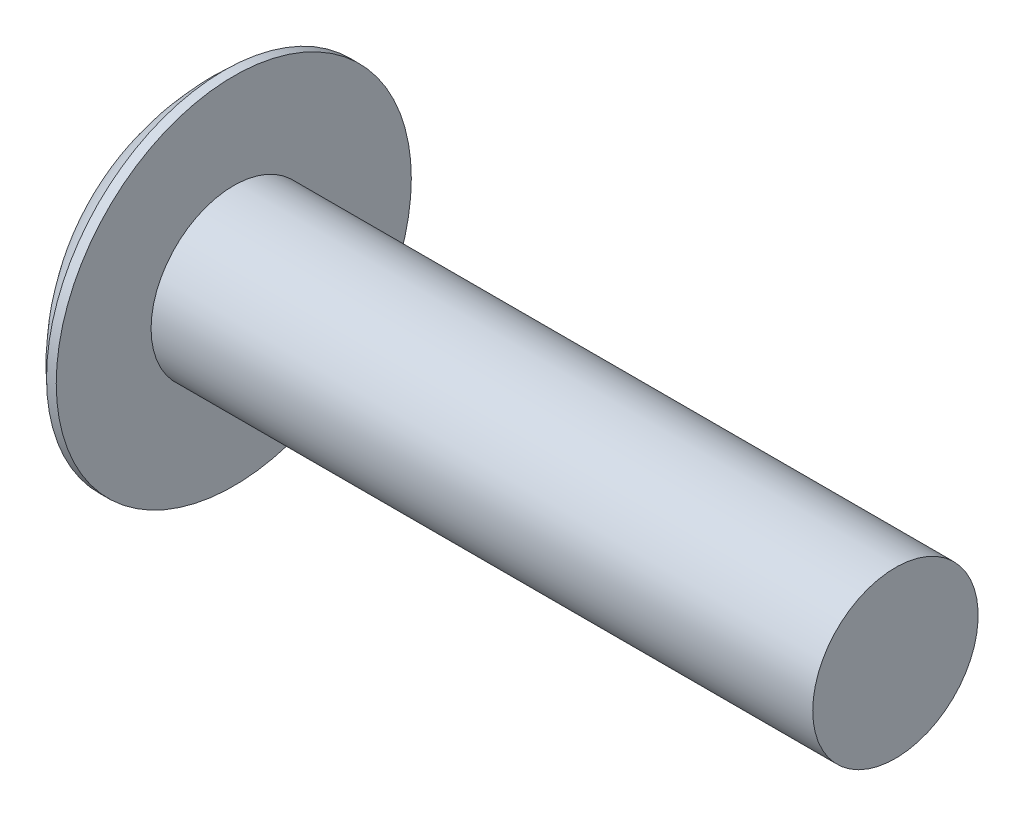
ISO-10303-21;
HEADER;
FILE_DESCRIPTION(('STEP AP214'),'2;1');
FILE_NAME('part.step','',(''),(''),'','','');
FILE_SCHEMA(('AUTOMOTIVE_DESIGN { 1 0 10303 214 1 1 1 1 }'));
ENDSEC;
DATA;
#1=APPLICATION_CONTEXT('core data for automotive mechanical design processes');
#2=APPLICATION_PROTOCOL_DEFINITION('international standard','automotive_design',2000,#1);
#3=PRODUCT_CONTEXT('',#1,'mechanical');
#4=PRODUCT('Part','Part','',(#3));
#5=PRODUCT_RELATED_PRODUCT_CATEGORY('part','',(#4));
#6=PRODUCT_DEFINITION_FORMATION('','',#4);
#7=PRODUCT_DEFINITION_CONTEXT('part definition',#1,'design');
#8=PRODUCT_DEFINITION('design','',#6,#7);
#9=PRODUCT_DEFINITION_SHAPE('','',#8);
#10=(LENGTH_UNIT() NAMED_UNIT(*) SI_UNIT(.MILLI.,.METRE.));
#11=(NAMED_UNIT(*) PLANE_ANGLE_UNIT() SI_UNIT($,.RADIAN.));
#12=(NAMED_UNIT(*) SI_UNIT($,.STERADIAN.) SOLID_ANGLE_UNIT());
#13=UNCERTAINTY_MEASURE_WITH_UNIT(LENGTH_MEASURE(1.E-05),#10,'distance_accuracy_value','');
#14=(GEOMETRIC_REPRESENTATION_CONTEXT(3) GLOBAL_UNCERTAINTY_ASSIGNED_CONTEXT((#13)) GLOBAL_UNIT_ASSIGNED_CONTEXT((#10,
#11,#12)) REPRESENTATION_CONTEXT('',''));
#15=CARTESIAN_POINT('',(0.,0.,0.));
#16=DIRECTION('',(0.,0.,1.));
#17=DIRECTION('',(1.,0.,0.));
#18=AXIS2_PLACEMENT_3D('',#15,#16,#17);
#19=CARTESIAN_POINT('',(13.6652,0.,0.));
#20=DIRECTION('',(-1.,0.,0.));
#21=DIRECTION('',(0.,1.,0.));
#22=AXIS2_PLACEMENT_3D('',#19,#20,#21);
#23=SPHERICAL_SURFACE('',#22,13.6652);
#24=CARTESIAN_POINT('',(4.59780021891611,0.,0.));
#25=DIRECTION('',(-1.,0.,0.));
#26=DIRECTION('',(0.,0.,1.));
#27=AXIS2_PLACEMENT_3D('',#24,#25,#26);
#28=CIRCLE('',#27,10.2235);
#29=CARTESIAN_POINT('',(4.59780021891611,0.,10.2235));
#30=VERTEX_POINT('',#29);
#31=EDGE_CURVE('E266',#30,#30,#28,.T.);
#32=ORIENTED_EDGE('',*,*,#31,.T.);
#33=EDGE_LOOP('',(#32));
#34=FACE_BOUND('',#33,.T.);
#35=CARTESIAN_POINT('',(13.6853681647485,0.294413621482627,0.));
#36=DIRECTION('',(-0.0683426588936529,-0.997661907148582,0.));
#37=DIRECTION('',(0.997661907148582,-0.0683426588936529,0.));
#38=AXIS2_PLACEMENT_3D('',#35,#36,#37);
#39=CIRCLE('',#38,13.6620132083312);
#40=CARTESIAN_POINT('',(1.5743937812783,1.12404957854235,6.26790304378582));
#41=VERTEX_POINT('',#40);
#42=CARTESIAN_POINT('',(0.110141872061403,1.22435497062856,1.22435497062856));
#43=VERTEX_POINT('',#42);
#44=EDGE_CURVE('E351',#41,#43,#39,.T.);
#45=ORIENTED_EDGE('',*,*,#44,.F.);
#46=CARTESIAN_POINT('',(12.2452923968943,0.,-1.8633819888764));
#47=DIRECTION('',(0.606093986265618,0.,0.795393034802702));
#48=DIRECTION('',(0.795393034802702,0.,-0.606093986265618));
#49=AXIS2_PLACEMENT_3D('',#46,#47,#48);
#50=CIRCLE('',#49,13.4628882860319);
#51=CARTESIAN_POINT('',(1.57312856055564,1.1049,6.26886714912462));
#52=VERTEX_POINT('',#51);
#53=EDGE_CURVE('E236',#41,#52,#50,.T.);
#54=ORIENTED_EDGE('',*,*,#53,.T.);
#55=CARTESIAN_POINT('',(13.6652,1.1049,0.));
#56=DIRECTION('',(0.,1.,0.));
#57=DIRECTION('',(0.,0.,1.));
#58=AXIS2_PLACEMENT_3D('',#55,#56,#57);
#59=CIRCLE('',#58,13.620458400142);
#60=CARTESIAN_POINT('',(2.8448,1.1049,8.27259517140782));
#61=VERTEX_POINT('',#60);
#62=EDGE_CURVE('E283',#52,#61,#59,.T.);
#63=ORIENTED_EDGE('',*,*,#62,.T.);
#64=CARTESIAN_POINT('',(2.8448,0.,0.));
#65=DIRECTION('',(-1.,0.,0.));
#66=DIRECTION('',(0.,0.,1.));
#67=AXIS2_PLACEMENT_3D('',#64,#65,#66);
#68=CIRCLE('',#67,8.34605504894378);
#69=CARTESIAN_POINT('',(2.8448,-1.1049,8.27259517140782));
#70=VERTEX_POINT('',#69);
#71=EDGE_CURVE('E275',#70,#61,#68,.T.);
#72=ORIENTED_EDGE('',*,*,#71,.F.);
#73=CARTESIAN_POINT('',(13.6652,-1.1049,0.));
#74=DIRECTION('',(0.,-1.,0.));
#75=DIRECTION('',(0.,0.,-1.));
#76=AXIS2_PLACEMENT_3D('',#73,#74,#75);
#77=CIRCLE('',#76,13.620458400142);
#78=CARTESIAN_POINT('',(1.57312856055563,-1.1049,6.26886714912462));
#79=VERTEX_POINT('',#78);
#80=EDGE_CURVE('E280',#70,#79,#77,.T.);
#81=ORIENTED_EDGE('',*,*,#80,.T.);
#82=CARTESIAN_POINT('',(1.5743937812783,-1.1240495785424,6.26790304378581));
#83=VERTEX_POINT('',#82);
#84=EDGE_CURVE('E368',#79,#83,#50,.T.);
#85=ORIENTED_EDGE('',*,*,#84,.T.);
#86=CARTESIAN_POINT('',(13.6853681647485,-0.294413621482627,0.));
#87=DIRECTION('',(-0.068342658893653,0.997661907148582,0.));
#88=DIRECTION('',(-0.997661907148582,-0.068342658893653,0.));
#89=AXIS2_PLACEMENT_3D('',#86,#87,#88);
#90=CIRCLE('',#89,13.6620132083312);
#91=CARTESIAN_POINT('',(0.110141872061405,-1.22435497062857,1.22435497062856));
#92=VERTEX_POINT('',#91);
#93=EDGE_CURVE('E298',#92,#83,#90,.T.);
#94=ORIENTED_EDGE('',*,*,#93,.F.);
#95=CARTESIAN_POINT('',(13.6853681647485,0.,0.294413621482627));
#96=DIRECTION('',(-0.068342658893653,0.,-0.997661907148582));
#97=DIRECTION('',(-0.997661907148582,0.,0.068342658893653));
#98=AXIS2_PLACEMENT_3D('',#95,#96,#97);
#99=CIRCLE('',#98,13.6620132083312);
#100=CARTESIAN_POINT('',(1.57439378127831,-6.26790304378581,1.12404957854238));
#101=VERTEX_POINT('',#100);
#102=EDGE_CURVE('E243',#101,#92,#99,.T.);
#103=ORIENTED_EDGE('',*,*,#102,.F.);
#104=CARTESIAN_POINT('',(12.2452923968943,1.8633819888764,0.));
#105=DIRECTION('',(0.606093986265618,-0.795393034802702,0.));
#106=DIRECTION('',(0.795393034802702,0.606093986265618,0.));
#107=AXIS2_PLACEMENT_3D('',#104,#105,#106);
#108=CIRCLE('',#107,13.4628882860319);
#109=CARTESIAN_POINT('',(1.57439378127831,-6.26790304378581,-1.12404957854238));
#110=VERTEX_POINT('',#109);
#111=EDGE_CURVE('E40',#101,#110,#108,.T.);
#112=ORIENTED_EDGE('',*,*,#111,.T.);
#113=CARTESIAN_POINT('',(13.6853681647485,0.,-0.294413621482627));
#114=DIRECTION('',(-0.0683426588936529,0.,0.997661907148582));
#115=DIRECTION('',(0.997661907148582,0.,0.0683426588936529));
#116=AXIS2_PLACEMENT_3D('',#113,#114,#115);
#117=CIRCLE('',#116,13.6620132083312);
#118=CARTESIAN_POINT('',(0.110141872061405,-1.22435497062856,-1.22435497062856));
#119=VERTEX_POINT('',#118);
#120=EDGE_CURVE('E252',#119,#110,#117,.T.);
#121=ORIENTED_EDGE('',*,*,#120,.F.);
#122=CARTESIAN_POINT('',(1.5743937812783,-1.12404957854236,-6.26790304378582));
#123=VERTEX_POINT('',#122);
#124=EDGE_CURVE('E47',#123,#119,#90,.T.);
#125=ORIENTED_EDGE('',*,*,#124,.F.);
#126=CARTESIAN_POINT('',(12.2452923968943,0.,1.8633819888764));
#127=DIRECTION('',(0.606093986265618,0.,-0.795393034802702));
#128=DIRECTION('',(-0.795393034802702,0.,-0.606093986265618));
#129=AXIS2_PLACEMENT_3D('',#126,#127,#128);
#130=CIRCLE('',#129,13.4628882860319);
#131=CARTESIAN_POINT('',(1.57312856055564,-1.1049,-6.26886714912463));
#132=VERTEX_POINT('',#131);
#133=EDGE_CURVE('E404',#123,#132,#130,.T.);
#134=ORIENTED_EDGE('',*,*,#133,.T.);
#135=CARTESIAN_POINT('',(2.8448,-1.1049,-8.27259517140782));
#136=VERTEX_POINT('',#135);
#137=EDGE_CURVE('E278',#132,#136,#77,.T.);
#138=ORIENTED_EDGE('',*,*,#137,.T.);
#139=CARTESIAN_POINT('',(2.8448,1.1049,-8.27259517140782));
#140=VERTEX_POINT('',#139);
#141=EDGE_CURVE('E279',#140,#136,#68,.T.);
#142=ORIENTED_EDGE('',*,*,#141,.F.);
#143=CARTESIAN_POINT('',(1.57312856055563,1.1049,-6.26886714912462));
#144=VERTEX_POINT('',#143);
#145=EDGE_CURVE('E284',#140,#144,#59,.T.);
#146=ORIENTED_EDGE('',*,*,#145,.T.);
#147=CARTESIAN_POINT('',(1.5743937812783,1.1240495785424,-6.26790304378581));
#148=VERTEX_POINT('',#147);
#149=EDGE_CURVE('E217',#144,#148,#130,.T.);
#150=ORIENTED_EDGE('',*,*,#149,.T.);
#151=CARTESIAN_POINT('',(0.110141872061403,1.22435497062857,-1.22435497062856));
#152=VERTEX_POINT('',#151);
#153=EDGE_CURVE('E353',#152,#148,#39,.T.);
#154=ORIENTED_EDGE('',*,*,#153,.F.);
#155=CARTESIAN_POINT('',(1.5743937812783,6.26790304378581,-1.12404957854238));
#156=VERTEX_POINT('',#155);
#157=EDGE_CURVE('E254',#156,#152,#117,.T.);
#158=ORIENTED_EDGE('',*,*,#157,.F.);
#159=CARTESIAN_POINT('',(12.2452923968943,-1.86338198887639,0.));
#160=DIRECTION('',(0.606093986265618,0.795393034802702,0.));
#161=DIRECTION('',(-0.795393034802702,0.606093986265618,0.));
#162=AXIS2_PLACEMENT_3D('',#159,#160,#161);
#163=CIRCLE('',#162,13.4628882860319);
#164=CARTESIAN_POINT('',(1.5743937812783,6.26790304378581,1.12404957854238));
#165=VERTEX_POINT('',#164);
#166=EDGE_CURVE('E11',#156,#165,#163,.T.);
#167=ORIENTED_EDGE('',*,*,#166,.T.);
#168=EDGE_CURVE('E245',#43,#165,#99,.T.);
#169=ORIENTED_EDGE('',*,*,#168,.F.);
#170=EDGE_LOOP('',(#45,#54,#63,#72,#81,#85,#94,#103,#112,#121,#125,#134,#138,#142,#146,#150,
#154,#158,#167,#169));
#171=FACE_BOUND('',#170,.T.);
#172=ADVANCED_FACE('F32',(#34,#171),#23,.T.);
#173=CARTESIAN_POINT('',(2.8448,1.1049,10.2235));
#174=DIRECTION('',(0.,1.,0.));
#175=DIRECTION('',(0.,0.,1.));
#176=AXIS2_PLACEMENT_3D('',#173,#174,#175);
#177=PLANE('',#176);
#178=DIRECTION('',(0.,0.,1.));
#179=VECTOR('',#178,1.);
#180=CARTESIAN_POINT('',(1.85393814432936,1.1049,10.2234999999999));
#181=LINE('',#180,#179);
#182=CARTESIAN_POINT('',(1.85393814432911,1.10490000000004,-6.0548886597944));
#183=VERTEX_POINT('',#182);
#184=CARTESIAN_POINT('',(1.85393814433002,1.1049,-1.10489999999999));
#185=VERTEX_POINT('',#184);
#186=EDGE_CURVE('E55',#183,#185,#181,.T.);
#187=ORIENTED_EDGE('',*,*,#186,.F.);
#188=DIRECTION('',(-0.795393034802702,0.,-0.606093986265618));
#189=VECTOR('',#188,1.);
#190=CARTESIAN_POINT('',(10.3283403604017,1.1049,0.40265370683152));
#191=LINE('',#190,#189);
#192=EDGE_CURVE('E400',#183,#144,#191,.T.);
#193=ORIENTED_EDGE('',*,*,#192,.T.);
#194=ORIENTED_EDGE('',*,*,#145,.F.);
#195=DIRECTION('',(0.,0.,-1.));
#196=VECTOR('',#195,1.);
#197=CARTESIAN_POINT('',(2.8448,1.1049,10.2235));
#198=LINE('',#197,#196);
#199=CARTESIAN_POINT('',(2.8448,1.1049,-1.03702316384181));
#200=VERTEX_POINT('',#199);
#201=EDGE_CURVE('E259',#200,#140,#198,.T.);
#202=ORIENTED_EDGE('',*,*,#201,.F.);
#203=DIRECTION('',(0.997661907148582,0.,0.0683426588936529));
#204=VECTOR('',#203,1.);
#205=CARTESIAN_POINT('',(3.61257475786375,1.1049,-0.984428424072896));
#206=LINE('',#205,#204);
#207=EDGE_CURVE('E249',#185,#200,#206,.T.);
#208=ORIENTED_EDGE('',*,*,#207,.F.);
#209=EDGE_LOOP('',(#187,#193,#194,#202,#208));
#210=FACE_BOUND('',#209,.T.);
#211=ADVANCED_FACE('F398',(#210),#177,.F.);
#212=CARTESIAN_POINT('',(2.8448,-1.1049,-10.2235));
#213=DIRECTION('',(0.,-1.,0.));
#214=DIRECTION('',(0.,0.,-1.));
#215=AXIS2_PLACEMENT_3D('',#212,#213,#214);
#216=PLANE('',#215);
#217=DIRECTION('',(0.,0.,-1.));
#218=VECTOR('',#217,1.);
#219=CARTESIAN_POINT('',(1.85393814432939,-1.1049,-10.2234999999999));
#220=LINE('',#219,#218);
#221=CARTESIAN_POINT('',(1.85393814433002,-1.10489999999999,-1.10489999999999));
#222=VERTEX_POINT('',#221);
#223=CARTESIAN_POINT('',(1.85393814432957,-1.1049,-6.05488865979406));
#224=VERTEX_POINT('',#223);
#225=EDGE_CURVE('E327',#222,#224,#220,.T.);
#226=ORIENTED_EDGE('',*,*,#225,.F.);
#227=DIRECTION('',(-0.997661907148582,0.,-0.0683426588936529));
#228=VECTOR('',#227,1.);
#229=CARTESIAN_POINT('',(2.2184396679019,-1.1049,-1.07993061597));
#230=LINE('',#229,#228);
#231=CARTESIAN_POINT('',(2.8448,-1.1049,-1.03702316384181));
#232=VERTEX_POINT('',#231);
#233=EDGE_CURVE('E246',#232,#222,#230,.T.);
#234=ORIENTED_EDGE('',*,*,#233,.F.);
#235=DIRECTION('',(0.,0.,1.));
#236=VECTOR('',#235,1.);
#237=CARTESIAN_POINT('',(2.8448,-1.1049,-10.2235));
#238=LINE('',#237,#236);
#239=EDGE_CURVE('E260',#136,#232,#238,.T.);
#240=ORIENTED_EDGE('',*,*,#239,.F.);
#241=ORIENTED_EDGE('',*,*,#137,.F.);
#242=DIRECTION('',(0.795393034802702,0.,0.606093986265618));
#243=VECTOR('',#242,1.);
#244=CARTESIAN_POINT('',(0.471190586177314,-1.1049,-7.10855011123918));
#245=LINE('',#244,#243);
#246=EDGE_CURVE('E408',#132,#224,#245,.T.);
#247=ORIENTED_EDGE('',*,*,#246,.T.);
#248=EDGE_LOOP('',(#226,#234,#240,#241,#247));
#249=FACE_BOUND('',#248,.T.);
#250=ADVANCED_FACE('F325',(#249),#216,.F.);
#251=CARTESIAN_POINT('',(2.8448,1.1049,-10.2235));
#252=DIRECTION('',(-1.,0.,0.));
#253=DIRECTION('',(0.,0.,1.));
#254=AXIS2_PLACEMENT_3D('',#251,#252,#253);
#255=PLANE('',#254);
#256=DIRECTION('',(0.,-1.,0.));
#257=VECTOR('',#256,1.);
#258=CARTESIAN_POINT('',(2.8448,1.10489999999999,-5.29984632768361));
#259=LINE('',#258,#257);
#260=CARTESIAN_POINT('',(2.8448,1.03702316384183,-5.29984632768361));
#261=VERTEX_POINT('',#260);
#262=CARTESIAN_POINT('',(2.8448,-1.03702316384179,-5.29984632768362));
#263=VERTEX_POINT('',#262);
#264=EDGE_CURVE('E338',#261,#263,#259,.T.);
#265=ORIENTED_EDGE('',*,*,#264,.F.);
#266=DIRECTION('',(0.,0.,1.));
#267=VECTOR('',#266,1.);
#268=CARTESIAN_POINT('',(2.8448,1.03702316384184,-10.2235));
#269=LINE('',#268,#267);
#270=CARTESIAN_POINT('',(2.8448,1.03702316384181,-1.03702316384181));
#271=VERTEX_POINT('',#270);
#272=EDGE_CURVE('E360',#261,#271,#269,.T.);
#273=ORIENTED_EDGE('',*,*,#272,.T.);
#274=DIRECTION('',(0.,1.,0.));
#275=VECTOR('',#274,1.);
#276=CARTESIAN_POINT('',(2.8448,1.1049,-1.03702316384181));
#277=LINE('',#276,#275);
#278=EDGE_CURVE('E290',#271,#200,#277,.T.);
#279=ORIENTED_EDGE('',*,*,#278,.T.);
#280=ORIENTED_EDGE('',*,*,#201,.T.);
#281=ORIENTED_EDGE('',*,*,#141,.T.);
#282=ORIENTED_EDGE('',*,*,#239,.T.);
#283=CARTESIAN_POINT('',(2.8448,-1.03702316384181,-1.03702316384181));
#284=VERTEX_POINT('',#283);
#285=EDGE_CURVE('E291',#232,#284,#277,.T.);
#286=ORIENTED_EDGE('',*,*,#285,.T.);
#287=DIRECTION('',(0.,0.,-1.));
#288=VECTOR('',#287,1.);
#289=CARTESIAN_POINT('',(2.8448,-1.03702316384177,-10.2235));
#290=LINE('',#289,#288);
#291=EDGE_CURVE('E336',#284,#263,#290,.T.);
#292=ORIENTED_EDGE('',*,*,#291,.T.);
#293=EDGE_LOOP('',(#265,#273,#279,#280,#281,#282,#286,#292));
#294=FACE_BOUND('',#293,.T.);
#295=ADVANCED_FACE('F318',(#294),#255,.T.);
#296=DIRECTION('',(0.,-1.,0.));
#297=VECTOR('',#296,1.);
#298=CARTESIAN_POINT('',(2.8448,1.1049,1.03702316384181));
#299=LINE('',#298,#297);
#300=CARTESIAN_POINT('',(2.8448,1.1049,1.03702316384181));
#301=VERTEX_POINT('',#300);
#302=CARTESIAN_POINT('',(2.8448,1.0370231638418,1.03702316384181));
#303=VERTEX_POINT('',#302);
#304=EDGE_CURVE('E287',#301,#303,#299,.T.);
#305=ORIENTED_EDGE('',*,*,#304,.T.);
#306=DIRECTION('',(0.,0.,1.));
#307=VECTOR('',#306,1.);
#308=CARTESIAN_POINT('',(2.8448,1.03702316384184,-10.2235));
#309=LINE('',#308,#307);
#310=CARTESIAN_POINT('',(2.8448,1.03702316384179,5.29984632768362));
#311=VERTEX_POINT('',#310);
#312=EDGE_CURVE('E354',#303,#311,#309,.T.);
#313=ORIENTED_EDGE('',*,*,#312,.T.);
#314=DIRECTION('',(0.,1.,0.));
#315=VECTOR('',#314,1.);
#316=CARTESIAN_POINT('',(2.8448,1.10489999999995,5.29984632768362));
#317=LINE('',#316,#315);
#318=CARTESIAN_POINT('',(2.8448,-1.03702316384183,5.29984632768361));
#319=VERTEX_POINT('',#318);
#320=EDGE_CURVE('E364',#319,#311,#317,.T.);
#321=ORIENTED_EDGE('',*,*,#320,.F.);
#322=DIRECTION('',(0.,0.,-1.));
#323=VECTOR('',#322,1.);
#324=CARTESIAN_POINT('',(2.8448,-1.03702316384177,-10.2235));
#325=LINE('',#324,#323);
#326=CARTESIAN_POINT('',(2.8448,-1.03702316384181,1.03702316384181));
#327=VERTEX_POINT('',#326);
#328=EDGE_CURVE('E188',#319,#327,#325,.T.);
#329=ORIENTED_EDGE('',*,*,#328,.T.);
#330=CARTESIAN_POINT('',(2.8448,-1.1049,1.03702316384181));
#331=VERTEX_POINT('',#330);
#332=EDGE_CURVE('E216',#327,#331,#299,.T.);
#333=ORIENTED_EDGE('',*,*,#332,.T.);
#334=EDGE_CURVE('E258',#331,#70,#238,.T.);
#335=ORIENTED_EDGE('',*,*,#334,.T.);
#336=ORIENTED_EDGE('',*,*,#71,.T.);
#337=EDGE_CURVE('E255',#61,#301,#198,.T.);
#338=ORIENTED_EDGE('',*,*,#337,.T.);
#339=EDGE_LOOP('',(#305,#313,#321,#329,#333,#335,#336,#338));
#340=FACE_BOUND('',#339,.T.);
#341=ADVANCED_FACE('F311',(#340),#255,.T.);
#342=CARTESIAN_POINT('',(9.79992734012975,0.,-0.560577293790547));
#343=DIRECTION('',(-0.0683426588936529,0.,0.997661907148582));
#344=DIRECTION('',(0.997661907148582,0.,0.0683426588936529));
#345=AXIS2_PLACEMENT_3D('',#342,#343,#344);
#346=PLANE('',#345);
#347=ORIENTED_EDGE('',*,*,#157,.T.);
#348=DIRECTION('',(0.995340138013783,-0.0681836111492495,0.0681836111492492));
#349=VECTOR('',#348,1.);
#350=CARTESIAN_POINT('',(9.83797141424539,0.557971167244491,-0.557971167244489));
#351=LINE('',#350,#349);
#352=EDGE_CURVE('E361',#152,#185,#351,.T.);
#353=ORIENTED_EDGE('',*,*,#352,.T.);
#354=ORIENTED_EDGE('',*,*,#207,.T.);
#355=ORIENTED_EDGE('',*,*,#278,.F.);
#356=CARTESIAN_POINT('',(8.9916,0.615950000000002,-0.615949999999998));
#357=VERTEX_POINT('',#356);
#358=EDGE_CURVE('E357',#271,#357,#351,.T.);
#359=ORIENTED_EDGE('',*,*,#358,.T.);
#360=DIRECTION('',(0.794214976916083,-0.60519629950032,0.0544059694638842));
#361=VECTOR('',#360,1.);
#362=CARTESIAN_POINT('',(0.,7.4676,-1.2319));
#363=LINE('',#362,#361);
#364=EDGE_CURVE('E240',#156,#357,#363,.T.);
#365=ORIENTED_EDGE('',*,*,#364,.F.);
#366=EDGE_LOOP('',(#347,#353,#354,#355,#359,#365));
#367=FACE_BOUND('',#366,.T.);
#368=ADVANCED_FACE('F390',(#367),#346,.T.);
#369=DIRECTION('',(0.794214976916083,0.60519629950032,0.0544059694638842));
#370=VECTOR('',#369,1.);
#371=CARTESIAN_POINT('',(0.,-7.4676,-1.2319));
#372=LINE('',#371,#370);
#373=CARTESIAN_POINT('',(8.9916,-0.61595,-0.61595));
#374=VERTEX_POINT('',#373);
#375=EDGE_CURVE('E226',#110,#374,#372,.T.);
#376=ORIENTED_EDGE('',*,*,#375,.T.);
#377=DIRECTION('',(-0.995340138013783,-0.0681836111492491,-0.0681836111492492));
#378=VECTOR('',#377,1.);
#379=CARTESIAN_POINT('',(9.83797141424539,-0.557971167244488,-0.557971167244489));
#380=LINE('',#379,#378);
#381=EDGE_CURVE('E334',#374,#284,#380,.T.);
#382=ORIENTED_EDGE('',*,*,#381,.T.);
#383=ORIENTED_EDGE('',*,*,#285,.F.);
#384=ORIENTED_EDGE('',*,*,#233,.T.);
#385=EDGE_CURVE('E331',#222,#119,#380,.T.);
#386=ORIENTED_EDGE('',*,*,#385,.T.);
#387=ORIENTED_EDGE('',*,*,#120,.T.);
#388=EDGE_LOOP('',(#376,#382,#383,#384,#386,#387));
#389=FACE_BOUND('',#388,.T.);
#390=ADVANCED_FACE('F330',(#389),#346,.T.);
#391=CARTESIAN_POINT('',(9.79992734012975,0.,0.560577293790547));
#392=DIRECTION('',(-0.068342658893653,0.,-0.997661907148582));
#393=DIRECTION('',(-0.997661907148582,0.,0.068342658893653));
#394=AXIS2_PLACEMENT_3D('',#391,#392,#393);
#395=PLANE('',#394);
#396=DIRECTION('',(0.794214976916083,-0.60519629950032,-0.0544059694638842));
#397=VECTOR('',#396,1.);
#398=CARTESIAN_POINT('',(0.,7.4676,1.2319));
#399=LINE('',#398,#397);
#400=CARTESIAN_POINT('',(8.9916,0.615949999999999,0.61595));
#401=VERTEX_POINT('',#400);
#402=EDGE_CURVE('E375',#165,#401,#399,.T.);
#403=ORIENTED_EDGE('',*,*,#402,.T.);
#404=DIRECTION('',(-0.995340138013783,0.068183611149249,0.0681836111492493));
#405=VECTOR('',#404,1.);
#406=CARTESIAN_POINT('',(9.83797141424539,0.557971167244487,0.55797116724449));
#407=LINE('',#406,#405);
#408=EDGE_CURVE('E346',#401,#303,#407,.T.);
#409=ORIENTED_EDGE('',*,*,#408,.T.);
#410=ORIENTED_EDGE('',*,*,#304,.F.);
#411=DIRECTION('',(-0.997661907148582,0.,0.068342658893653));
#412=VECTOR('',#411,1.);
#413=CARTESIAN_POINT('',(2.2184396679019,1.1049,1.07993061597));
#414=LINE('',#413,#412);
#415=CARTESIAN_POINT('',(1.85393814433001,1.10489999999999,1.10489999999999));
#416=VERTEX_POINT('',#415);
#417=EDGE_CURVE('E239',#301,#416,#414,.T.);
#418=ORIENTED_EDGE('',*,*,#417,.T.);
#419=EDGE_CURVE('E341',#416,#43,#407,.T.);
#420=ORIENTED_EDGE('',*,*,#419,.T.);
#421=ORIENTED_EDGE('',*,*,#168,.T.);
#422=EDGE_LOOP('',(#403,#409,#410,#418,#420,#421));
#423=FACE_BOUND('',#422,.T.);
#424=ADVANCED_FACE('F380',(#423),#395,.T.);
#425=ORIENTED_EDGE('',*,*,#102,.T.);
#426=DIRECTION('',(0.995340138013783,0.0681836111492496,-0.0681836111492493));
#427=VECTOR('',#426,1.);
#428=CARTESIAN_POINT('',(9.83797141424539,-0.557971167244492,0.55797116724449));
#429=LINE('',#428,#427);
#430=CARTESIAN_POINT('',(1.85393814433003,-1.1049,1.10489999999999));
#431=VERTEX_POINT('',#430);
#432=EDGE_CURVE('E219',#92,#431,#429,.T.);
#433=ORIENTED_EDGE('',*,*,#432,.T.);
#434=DIRECTION('',(0.997661907148582,0.,-0.068342658893653));
#435=VECTOR('',#434,1.);
#436=CARTESIAN_POINT('',(3.61257475786375,-1.1049,0.984428424072896));
#437=LINE('',#436,#435);
#438=EDGE_CURVE('E237',#431,#331,#437,.T.);
#439=ORIENTED_EDGE('',*,*,#438,.T.);
#440=ORIENTED_EDGE('',*,*,#332,.F.);
#441=CARTESIAN_POINT('',(8.9916,-0.615950000000003,0.615949999999997));
#442=VERTEX_POINT('',#441);
#443=EDGE_CURVE('E186',#327,#442,#429,.T.);
#444=ORIENTED_EDGE('',*,*,#443,.T.);
#445=DIRECTION('',(0.794214976916083,0.60519629950032,-0.0544059694638843));
#446=VECTOR('',#445,1.);
#447=CARTESIAN_POINT('',(0.,-7.4676,1.2319));
#448=LINE('',#447,#446);
#449=EDGE_CURVE('E213',#101,#442,#448,.T.);
#450=ORIENTED_EDGE('',*,*,#449,.F.);
#451=EDGE_LOOP('',(#425,#433,#439,#440,#444,#450));
#452=FACE_BOUND('',#451,.T.);
#453=ADVANCED_FACE('F212',(#452),#395,.T.);
#454=ORIENTED_EDGE('',*,*,#62,.F.);
#455=DIRECTION('',(0.795393034802702,0.,-0.606093986265618));
#456=VECTOR('',#455,1.);
#457=CARTESIAN_POINT('',(0.471190586177314,1.1049,7.10855011123918));
#458=LINE('',#457,#456);
#459=CARTESIAN_POINT('',(1.85393814432958,1.1049,6.05488865979406));
#460=VERTEX_POINT('',#459);
#461=EDGE_CURVE('E370',#52,#460,#458,.T.);
#462=ORIENTED_EDGE('',*,*,#461,.T.);
#463=DIRECTION('',(0.,0.,1.));
#464=VECTOR('',#463,1.);
#465=CARTESIAN_POINT('',(1.85393814432936,1.1049,10.2234999999999));
#466=LINE('',#465,#464);
#467=EDGE_CURVE('E344',#416,#460,#466,.T.);
#468=ORIENTED_EDGE('',*,*,#467,.F.);
#469=ORIENTED_EDGE('',*,*,#417,.F.);
#470=ORIENTED_EDGE('',*,*,#337,.F.);
#471=EDGE_LOOP('',(#454,#462,#468,#469,#470));
#472=FACE_BOUND('',#471,.T.);
#473=ADVANCED_FACE('F425',(#472),#177,.F.);
#474=DIRECTION('',(0.,0.,-1.));
#475=VECTOR('',#474,1.);
#476=CARTESIAN_POINT('',(1.85393814432939,-1.1049,-10.2234999999999));
#477=LINE('',#476,#475);
#478=CARTESIAN_POINT('',(1.85393814433023,-1.1049,6.05488865979356));
#479=VERTEX_POINT('',#478);
#480=EDGE_CURVE('E303',#479,#431,#477,.T.);
#481=ORIENTED_EDGE('',*,*,#480,.F.);
#482=DIRECTION('',(-0.795393034802702,0.,0.606093986265618));
#483=VECTOR('',#482,1.);
#484=CARTESIAN_POINT('',(10.3283403604017,-1.1049,-0.402653706831516));
#485=LINE('',#484,#483);
#486=EDGE_CURVE('E366',#479,#79,#485,.T.);
#487=ORIENTED_EDGE('',*,*,#486,.T.);
#488=ORIENTED_EDGE('',*,*,#80,.F.);
#489=ORIENTED_EDGE('',*,*,#334,.F.);
#490=ORIENTED_EDGE('',*,*,#438,.F.);
#491=EDGE_LOOP('',(#481,#487,#488,#489,#490));
#492=FACE_BOUND('',#491,.T.);
#493=ADVANCED_FACE('F306',(#492),#216,.F.);
#494=CARTESIAN_POINT('',(-25.4,0.,0.));
#495=DIRECTION('',(-1.,0.,0.));
#496=DIRECTION('',(0.,0.,1.));
#497=AXIS2_PLACEMENT_3D('',#494,#495,#496);
#498=CYLINDRICAL_SURFACE('',#497,4.7625);
#499=CARTESIAN_POINT('',(43.2562,0.,0.));
#500=DIRECTION('',(-1.,0.,0.));
#501=DIRECTION('',(0.,0.,1.));
#502=AXIS2_PLACEMENT_3D('',#499,#500,#501);
#503=CIRCLE('',#502,4.7625);
#504=CARTESIAN_POINT('',(43.2562,0.,4.7625));
#505=VERTEX_POINT('',#504);
#506=EDGE_CURVE('E263',#505,#505,#503,.T.);
#507=ORIENTED_EDGE('',*,*,#506,.T.);
#508=EDGE_LOOP('',(#507));
#509=FACE_BOUND('',#508,.T.);
#510=CARTESIAN_POINT('',(5.1562,0.,0.));
#511=DIRECTION('',(-1.,0.,0.));
#512=DIRECTION('',(0.,0.,1.));
#513=AXIS2_PLACEMENT_3D('',#510,#511,#512);
#514=CIRCLE('',#513,4.7625);
#515=CARTESIAN_POINT('',(5.1562,0.,4.7625));
#516=VERTEX_POINT('',#515);
#517=EDGE_CURVE('E272',#516,#516,#514,.T.);
#518=ORIENTED_EDGE('',*,*,#517,.F.);
#519=EDGE_LOOP('',(#518));
#520=FACE_BOUND('',#519,.T.);
#521=ADVANCED_FACE('F34',(#509,#520),#498,.T.);
#522=CARTESIAN_POINT('',(5.1562,4.7625,0.));
#523=DIRECTION('',(-1.,0.,0.));
#524=DIRECTION('',(0.,0.,1.));
#525=AXIS2_PLACEMENT_3D('',#522,#523,#524);
#526=PLANE('',#525);
#527=CARTESIAN_POINT('',(5.1562,0.,0.));
#528=DIRECTION('',(-1.,0.,0.));
#529=DIRECTION('',(0.,0.,1.));
#530=AXIS2_PLACEMENT_3D('',#527,#528,#529);
#531=CIRCLE('',#530,10.2235);
#532=CARTESIAN_POINT('',(5.1562,0.,10.2235));
#533=VERTEX_POINT('',#532);
#534=EDGE_CURVE('E269',#533,#533,#531,.T.);
#535=ORIENTED_EDGE('',*,*,#534,.F.);
#536=EDGE_LOOP('',(#535));
#537=FACE_BOUND('',#536,.T.);
#538=ORIENTED_EDGE('',*,*,#517,.T.);
#539=EDGE_LOOP('',(#538));
#540=FACE_BOUND('',#539,.T.);
#541=ADVANCED_FACE('F458',(#537,#540),#526,.F.);
#542=CARTESIAN_POINT('',(-25.4,0.,0.));
#543=DIRECTION('',(-1.,0.,0.));
#544=DIRECTION('',(0.,0.,1.));
#545=AXIS2_PLACEMENT_3D('',#542,#543,#544);
#546=CYLINDRICAL_SURFACE('',#545,10.2235);
#547=ORIENTED_EDGE('',*,*,#534,.T.);
#548=EDGE_LOOP('',(#547));
#549=FACE_BOUND('',#548,.T.);
#550=ORIENTED_EDGE('',*,*,#31,.F.);
#551=EDGE_LOOP('',(#550));
#552=FACE_BOUND('',#551,.T.);
#553=ADVANCED_FACE('F456',(#549,#552),#546,.T.);
#554=CARTESIAN_POINT('',(43.2562,4.7625,0.));
#555=DIRECTION('',(1.,0.,0.));
#556=DIRECTION('',(0.,0.,-1.));
#557=AXIS2_PLACEMENT_3D('',#554,#555,#556);
#558=PLANE('',#557);
#559=ORIENTED_EDGE('',*,*,#506,.F.);
#560=EDGE_LOOP('',(#559));
#561=FACE_BOUND('',#560,.T.);
#562=ADVANCED_FACE('F455',(#561),#558,.T.);
#563=CARTESIAN_POINT('',(8.9916,0.61595,0.61595));
#564=DIRECTION('',(0.606093986265618,0.795393034802702,0.));
#565=DIRECTION('',(-0.795393034802702,0.606093986265618,0.));
#566=AXIS2_PLACEMENT_3D('',#563,#564,#565);
#567=PLANE('',#566);
#568=ORIENTED_EDGE('',*,*,#364,.T.);
#569=DIRECTION('',(0.,0.,-1.));
#570=VECTOR('',#569,1.);
#571=CARTESIAN_POINT('',(8.9916,0.61595,0.615950000000001));
#572=LINE('',#571,#570);
#573=EDGE_CURVE('E205',#401,#357,#572,.T.);
#574=ORIENTED_EDGE('',*,*,#573,.F.);
#575=ORIENTED_EDGE('',*,*,#402,.F.);
#576=ORIENTED_EDGE('',*,*,#166,.F.);
#577=EDGE_LOOP('',(#568,#574,#575,#576));
#578=FACE_BOUND('',#577,.T.);
#579=ADVANCED_FACE('F383',(#578),#567,.F.);
#580=CARTESIAN_POINT('',(8.9916,-0.61595,-0.61595));
#581=DIRECTION('',(0.606093986265618,-0.795393034802702,0.));
#582=DIRECTION('',(0.795393034802702,0.606093986265618,0.));
#583=AXIS2_PLACEMENT_3D('',#580,#581,#582);
#584=PLANE('',#583);
#585=ORIENTED_EDGE('',*,*,#449,.T.);
#586=DIRECTION('',(0.,0.,1.));
#587=VECTOR('',#586,1.);
#588=CARTESIAN_POINT('',(8.9916,-0.61595,-0.61595));
#589=LINE('',#588,#587);
#590=EDGE_CURVE('E204',#374,#442,#589,.T.);
#591=ORIENTED_EDGE('',*,*,#590,.F.);
#592=ORIENTED_EDGE('',*,*,#375,.F.);
#593=ORIENTED_EDGE('',*,*,#111,.F.);
#594=EDGE_LOOP('',(#585,#591,#592,#593));
#595=FACE_BOUND('',#594,.T.);
#596=ADVANCED_FACE('F222',(#595),#584,.F.);
#597=CARTESIAN_POINT('',(8.9916,0.61595,-0.61595));
#598=DIRECTION('',(-1.,0.,0.));
#599=DIRECTION('',(0.,0.,1.));
#600=AXIS2_PLACEMENT_3D('',#597,#598,#599);
#601=PLANE('',#600);
#602=DIRECTION('',(0.,1.,0.));
#603=VECTOR('',#602,1.);
#604=CARTESIAN_POINT('',(8.9916,-0.61595,-0.61595));
#605=LINE('',#604,#603);
#606=EDGE_CURVE('E230',#374,#357,#605,.T.);
#607=ORIENTED_EDGE('',*,*,#606,.F.);
#608=ORIENTED_EDGE('',*,*,#590,.T.);
#609=DIRECTION('',(0.,-1.,0.));
#610=VECTOR('',#609,1.);
#611=CARTESIAN_POINT('',(8.9916,0.61595,0.615950000000001));
#612=LINE('',#611,#610);
#613=EDGE_CURVE('E195',#401,#442,#612,.T.);
#614=ORIENTED_EDGE('',*,*,#613,.F.);
#615=ORIENTED_EDGE('',*,*,#573,.T.);
#616=EDGE_LOOP('',(#607,#608,#614,#615));
#617=FACE_BOUND('',#616,.T.);
#618=ADVANCED_FACE('F228',(#617),#601,.T.);
#619=CARTESIAN_POINT('',(8.9916,0.615950000000002,-0.615949999999998));
#620=DIRECTION('',(0.606093986265618,0.,-0.795393034802702));
#621=DIRECTION('',(0.795393034802702,0.,0.606093986265618));
#622=AXIS2_PLACEMENT_3D('',#619,#620,#621);
#623=PLANE('',#622);
#624=ORIENTED_EDGE('',*,*,#264,.T.);
#625=DIRECTION('',(0.794214976916083,0.0544059694638822,0.60519629950032));
#626=VECTOR('',#625,1.);
#627=CARTESIAN_POINT('',(0.,-1.23189999999998,-7.4676));
#628=LINE('',#627,#626);
#629=EDGE_CURVE('E412',#263,#374,#628,.T.);
#630=ORIENTED_EDGE('',*,*,#629,.T.);
#631=ORIENTED_EDGE('',*,*,#606,.T.);
#632=DIRECTION('',(0.794214976916083,-0.0544059694638863,0.60519629950032));
#633=VECTOR('',#632,1.);
#634=CARTESIAN_POINT('',(0.,1.23190000000003,-7.4676));
#635=LINE('',#634,#633);
#636=EDGE_CURVE('E396',#261,#357,#635,.T.);
#637=ORIENTED_EDGE('',*,*,#636,.F.);
#638=EDGE_LOOP('',(#624,#630,#631,#637));
#639=FACE_BOUND('',#638,.T.);
#640=ADVANCED_FACE('F489',(#639),#623,.F.);
#641=CARTESIAN_POINT('',(9.79992734012975,-0.560577293790547,0.));
#642=DIRECTION('',(-0.068342658893653,0.997661907148582,0.));
#643=DIRECTION('',(-0.997661907148582,-0.068342658893653,0.));
#644=AXIS2_PLACEMENT_3D('',#641,#642,#643);
#645=PLANE('',#644);
#646=ORIENTED_EDGE('',*,*,#381,.F.);
#647=ORIENTED_EDGE('',*,*,#629,.F.);
#648=ORIENTED_EDGE('',*,*,#291,.F.);
#649=EDGE_LOOP('',(#646,#647,#648));
#650=FACE_BOUND('',#649,.T.);
#651=ADVANCED_FACE('F564',(#650),#645,.T.);
#652=CARTESIAN_POINT('',(9.79992734012975,0.560577293790547,0.));
#653=DIRECTION('',(-0.0683426588936529,-0.997661907148582,0.));
#654=DIRECTION('',(0.997661907148582,-0.0683426588936529,0.));
#655=AXIS2_PLACEMENT_3D('',#652,#653,#654);
#656=PLANE('',#655);
#657=ORIENTED_EDGE('',*,*,#636,.T.);
#658=ORIENTED_EDGE('',*,*,#358,.F.);
#659=ORIENTED_EDGE('',*,*,#272,.F.);
#660=EDGE_LOOP('',(#657,#658,#659));
#661=FACE_BOUND('',#660,.T.);
#662=ADVANCED_FACE('F394',(#661),#656,.T.);
#663=CARTESIAN_POINT('',(8.9916,-0.615950000000002,0.615949999999998));
#664=DIRECTION('',(0.606093986265618,0.,0.795393034802702));
#665=DIRECTION('',(-0.795393034802702,0.,0.606093986265618));
#666=AXIS2_PLACEMENT_3D('',#663,#664,#665);
#667=PLANE('',#666);
#668=ORIENTED_EDGE('',*,*,#320,.T.);
#669=DIRECTION('',(0.794214976916083,-0.0544059694638821,-0.60519629950032));
#670=VECTOR('',#669,1.);
#671=CARTESIAN_POINT('',(0.,1.23189999999997,7.4676));
#672=LINE('',#671,#670);
#673=EDGE_CURVE('E198',#311,#401,#672,.T.);
#674=ORIENTED_EDGE('',*,*,#673,.T.);
#675=ORIENTED_EDGE('',*,*,#613,.T.);
#676=DIRECTION('',(0.794214976916083,0.0544059694638864,-0.60519629950032));
#677=VECTOR('',#676,1.);
#678=CARTESIAN_POINT('',(0.,-1.23190000000003,7.4676));
#679=LINE('',#678,#677);
#680=EDGE_CURVE('E182',#319,#442,#679,.T.);
#681=ORIENTED_EDGE('',*,*,#680,.F.);
#682=EDGE_LOOP('',(#668,#674,#675,#681));
#683=FACE_BOUND('',#682,.T.);
#684=ADVANCED_FACE('F196',(#683),#667,.F.);
#685=ORIENTED_EDGE('',*,*,#680,.T.);
#686=ORIENTED_EDGE('',*,*,#443,.F.);
#687=ORIENTED_EDGE('',*,*,#328,.F.);
#688=EDGE_LOOP('',(#685,#686,#687));
#689=FACE_BOUND('',#688,.T.);
#690=ADVANCED_FACE('F184',(#689),#645,.T.);
#691=ORIENTED_EDGE('',*,*,#408,.F.);
#692=ORIENTED_EDGE('',*,*,#673,.F.);
#693=ORIENTED_EDGE('',*,*,#312,.F.);
#694=EDGE_LOOP('',(#691,#692,#693));
#695=FACE_BOUND('',#694,.T.);
#696=ADVANCED_FACE('F443',(#695),#656,.T.);
#697=ORIENTED_EDGE('',*,*,#93,.T.);
#698=EDGE_CURVE('E191',#83,#479,#679,.T.);
#699=ORIENTED_EDGE('',*,*,#698,.T.);
#700=ORIENTED_EDGE('',*,*,#480,.T.);
#701=ORIENTED_EDGE('',*,*,#432,.F.);
#702=EDGE_LOOP('',(#697,#699,#700,#701));
#703=FACE_BOUND('',#702,.T.);
#704=ADVANCED_FACE('F419',(#703),#645,.T.);
#705=ORIENTED_EDGE('',*,*,#486,.F.);
#706=ORIENTED_EDGE('',*,*,#698,.F.);
#707=ORIENTED_EDGE('',*,*,#84,.F.);
#708=EDGE_LOOP('',(#705,#706,#707));
#709=FACE_BOUND('',#708,.T.);
#710=ADVANCED_FACE('F421',(#709),#667,.F.);
#711=ORIENTED_EDGE('',*,*,#44,.T.);
#712=ORIENTED_EDGE('',*,*,#419,.F.);
#713=ORIENTED_EDGE('',*,*,#467,.T.);
#714=EDGE_CURVE('E409',#41,#460,#672,.T.);
#715=ORIENTED_EDGE('',*,*,#714,.F.);
#716=EDGE_LOOP('',(#711,#712,#713,#715));
#717=FACE_BOUND('',#716,.T.);
#718=ADVANCED_FACE('F429',(#717),#656,.T.);
#719=ORIENTED_EDGE('',*,*,#714,.T.);
#720=ORIENTED_EDGE('',*,*,#461,.F.);
#721=ORIENTED_EDGE('',*,*,#53,.F.);
#722=EDGE_LOOP('',(#719,#720,#721));
#723=FACE_BOUND('',#722,.T.);
#724=ADVANCED_FACE('F432',(#723),#667,.F.);
#725=ORIENTED_EDGE('',*,*,#124,.T.);
#726=ORIENTED_EDGE('',*,*,#385,.F.);
#727=ORIENTED_EDGE('',*,*,#225,.T.);
#728=EDGE_CURVE('E414',#123,#224,#628,.T.);
#729=ORIENTED_EDGE('',*,*,#728,.F.);
#730=EDGE_LOOP('',(#725,#726,#727,#729));
#731=FACE_BOUND('',#730,.T.);
#732=ADVANCED_FACE('F434',(#731),#645,.T.);
#733=ORIENTED_EDGE('',*,*,#728,.T.);
#734=ORIENTED_EDGE('',*,*,#246,.F.);
#735=ORIENTED_EDGE('',*,*,#133,.F.);
#736=EDGE_LOOP('',(#733,#734,#735));
#737=FACE_BOUND('',#736,.T.);
#738=ADVANCED_FACE('F440',(#737),#623,.F.);
#739=ORIENTED_EDGE('',*,*,#153,.T.);
#740=EDGE_CURVE('E192',#148,#183,#635,.T.);
#741=ORIENTED_EDGE('',*,*,#740,.T.);
#742=ORIENTED_EDGE('',*,*,#186,.T.);
#743=ORIENTED_EDGE('',*,*,#352,.F.);
#744=EDGE_LOOP('',(#739,#741,#742,#743));
#745=FACE_BOUND('',#744,.T.);
#746=ADVANCED_FACE('F582',(#745),#656,.T.);
#747=ORIENTED_EDGE('',*,*,#192,.F.);
#748=ORIENTED_EDGE('',*,*,#740,.F.);
#749=ORIENTED_EDGE('',*,*,#149,.F.);
#750=EDGE_LOOP('',(#747,#748,#749));
#751=FACE_BOUND('',#750,.T.);
#752=ADVANCED_FACE('F566',(#751),#623,.F.);
#753=CLOSED_SHELL('',(#172,#211,#250,#295,#341,#368,#390,#424,#453,#473,#493,#521,#541,#553,
#562,#579,#596,#618,#640,#651,#662,#684,#690,#696,#704,#710,#718,#724,#732,#738,#746,#752));
#754=MANIFOLD_SOLID_BREP('B2',#753);
#755=ADVANCED_BREP_SHAPE_REPRESENTATION('',(#18,#754),#14);
#756=SHAPE_DEFINITION_REPRESENTATION(#9,#755);
ENDSEC;
END-ISO-10303-21;
